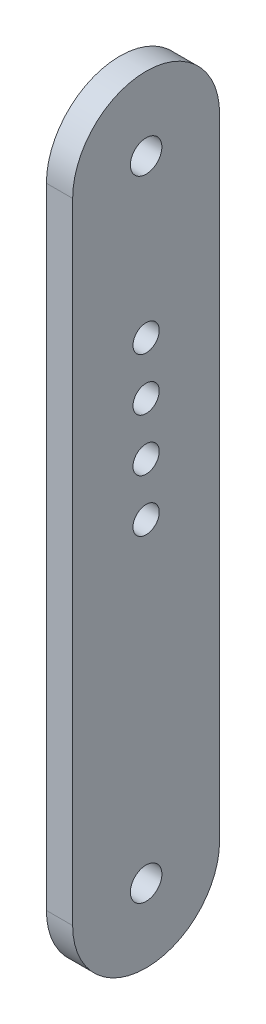
ISO-10303-21;
HEADER;
FILE_DESCRIPTION(('STEP AP214'),'2;1');
FILE_NAME('part.step','',(''),(''),'','','');
FILE_SCHEMA(('AUTOMOTIVE_DESIGN { 1 0 10303 214 1 1 1 1 }'));
ENDSEC;
DATA;
#1=APPLICATION_CONTEXT('core data for automotive mechanical design processes');
#2=APPLICATION_PROTOCOL_DEFINITION('international standard','automotive_design',2000,#1);
#3=PRODUCT_CONTEXT('',#1,'mechanical');
#4=PRODUCT('Part','Part','',(#3));
#5=PRODUCT_RELATED_PRODUCT_CATEGORY('part','',(#4));
#6=PRODUCT_DEFINITION_FORMATION('','',#4);
#7=PRODUCT_DEFINITION_CONTEXT('part definition',#1,'design');
#8=PRODUCT_DEFINITION('design','',#6,#7);
#9=PRODUCT_DEFINITION_SHAPE('','',#8);
#10=(LENGTH_UNIT() NAMED_UNIT(*) SI_UNIT(.MILLI.,.METRE.));
#11=(NAMED_UNIT(*) PLANE_ANGLE_UNIT() SI_UNIT($,.RADIAN.));
#12=(NAMED_UNIT(*) SI_UNIT($,.STERADIAN.) SOLID_ANGLE_UNIT());
#13=UNCERTAINTY_MEASURE_WITH_UNIT(LENGTH_MEASURE(1.E-05),#10,'distance_accuracy_value','');
#14=(GEOMETRIC_REPRESENTATION_CONTEXT(3) GLOBAL_UNCERTAINTY_ASSIGNED_CONTEXT((#13)) GLOBAL_UNIT_ASSIGNED_CONTEXT((#10,
#11,#12)) REPRESENTATION_CONTEXT('',''));
#15=CARTESIAN_POINT('',(0.,0.,0.));
#16=DIRECTION('',(0.,0.,1.));
#17=DIRECTION('',(1.,0.,0.));
#18=AXIS2_PLACEMENT_3D('',#15,#16,#17);
#19=CARTESIAN_POINT('',(2.5,0.,0.));
#20=DIRECTION('',(1.,0.,0.));
#21=DIRECTION('',(0.,0.,-1.));
#22=AXIS2_PLACEMENT_3D('',#19,#20,#21);
#23=PLANE('',#22);
#24=CARTESIAN_POINT('',(2.5,35.,-1.11022302462516E-13));
#25=DIRECTION('',(1.,0.,0.));
#26=DIRECTION('',(0.,0.,-1.));
#27=AXIS2_PLACEMENT_3D('',#24,#25,#26);
#28=CIRCLE('',#27,1.25);
#29=CARTESIAN_POINT('',(2.5,35.,-1.25000000000011));
#30=VERTEX_POINT('',#29);
#31=EDGE_CURVE('E161',#30,#30,#28,.T.);
#32=ORIENTED_EDGE('',*,*,#31,.F.);
#33=EDGE_LOOP('',(#32));
#34=FACE_BOUND('',#33,.T.);
#35=CARTESIAN_POINT('',(2.5,45.,0.));
#36=DIRECTION('',(1.,0.,0.));
#37=DIRECTION('',(0.,0.,-1.));
#38=AXIS2_PLACEMENT_3D('',#35,#36,#37);
#39=CIRCLE('',#38,1.25);
#40=CARTESIAN_POINT('',(2.5,45.,-1.25));
#41=VERTEX_POINT('',#40);
#42=EDGE_CURVE('E145',#41,#41,#39,.T.);
#43=ORIENTED_EDGE('',*,*,#42,.F.);
#44=EDGE_LOOP('',(#43));
#45=FACE_BOUND('',#44,.T.);
#46=CARTESIAN_POINT('',(2.5,0.,0.));
#47=DIRECTION('',(1.,0.,0.));
#48=DIRECTION('',(0.,0.,-1.));
#49=AXIS2_PLACEMENT_3D('',#46,#47,#48);
#50=CIRCLE('',#49,1.5);
#51=CARTESIAN_POINT('',(2.5,0.,-1.5));
#52=VERTEX_POINT('',#51);
#53=EDGE_CURVE('E113',#52,#52,#50,.T.);
#54=ORIENTED_EDGE('',*,*,#53,.F.);
#55=EDGE_LOOP('',(#54));
#56=FACE_BOUND('',#55,.T.);
#57=CARTESIAN_POINT('',(2.5,0.,0.));
#58=DIRECTION('',(1.,0.,0.));
#59=DIRECTION('',(0.,0.,-1.));
#60=AXIS2_PLACEMENT_3D('',#57,#58,#59);
#61=CIRCLE('',#60,7.);
#62=CARTESIAN_POINT('',(2.5,0.,7.00000000000001));
#63=VERTEX_POINT('',#62);
#64=CARTESIAN_POINT('',(2.5,0.,-7.00000000000001));
#65=VERTEX_POINT('',#64);
#66=EDGE_CURVE('E92',#63,#65,#61,.T.);
#67=ORIENTED_EDGE('',*,*,#66,.T.);
#68=DIRECTION('',(0.,1.,0.));
#69=VECTOR('',#68,1.);
#70=CARTESIAN_POINT('',(2.5,0.,-7.00000000000001));
#71=LINE('',#70,#69);
#72=CARTESIAN_POINT('',(2.5,60.,-7.00000000000001));
#73=VERTEX_POINT('',#72);
#74=EDGE_CURVE('E87',#65,#73,#71,.T.);
#75=ORIENTED_EDGE('',*,*,#74,.T.);
#76=CARTESIAN_POINT('',(2.5,60.,0.));
#77=DIRECTION('',(1.,0.,0.));
#78=DIRECTION('',(0.,0.,-1.));
#79=AXIS2_PLACEMENT_3D('',#76,#77,#78);
#80=CIRCLE('',#79,7.);
#81=CARTESIAN_POINT('',(2.5,60.,7.00000000000001));
#82=VERTEX_POINT('',#81);
#83=EDGE_CURVE('E90',#73,#82,#80,.T.);
#84=ORIENTED_EDGE('',*,*,#83,.T.);
#85=DIRECTION('',(0.,-1.,0.));
#86=VECTOR('',#85,1.);
#87=CARTESIAN_POINT('',(2.5,0.,7.00000000000001));
#88=LINE('',#87,#86);
#89=EDGE_CURVE('E57',#82,#63,#88,.T.);
#90=ORIENTED_EDGE('',*,*,#89,.T.);
#91=EDGE_LOOP('',(#67,#75,#84,#90));
#92=FACE_BOUND('',#91,.T.);
#93=CARTESIAN_POINT('',(2.5,60.,0.));
#94=DIRECTION('',(1.,0.,0.));
#95=DIRECTION('',(0.,0.,-1.));
#96=AXIS2_PLACEMENT_3D('',#93,#94,#95);
#97=CIRCLE('',#96,1.5);
#98=CARTESIAN_POINT('',(2.5,60.,-1.5));
#99=VERTEX_POINT('',#98);
#100=EDGE_CURVE('E137',#99,#99,#97,.T.);
#101=ORIENTED_EDGE('',*,*,#100,.F.);
#102=EDGE_LOOP('',(#101));
#103=FACE_BOUND('',#102,.T.);
#104=CARTESIAN_POINT('',(2.5,40.,0.));
#105=DIRECTION('',(1.,0.,0.));
#106=DIRECTION('',(0.,0.,-1.));
#107=AXIS2_PLACEMENT_3D('',#104,#105,#106);
#108=CIRCLE('',#107,1.25);
#109=CARTESIAN_POINT('',(2.5,40.,-1.25000000000006));
#110=VERTEX_POINT('',#109);
#111=EDGE_CURVE('E153',#110,#110,#108,.T.);
#112=ORIENTED_EDGE('',*,*,#111,.F.);
#113=EDGE_LOOP('',(#112));
#114=FACE_BOUND('',#113,.T.);
#115=CARTESIAN_POINT('',(2.5,30.,-1.66533453693773E-13));
#116=DIRECTION('',(1.,0.,0.));
#117=DIRECTION('',(0.,0.,-1.));
#118=AXIS2_PLACEMENT_3D('',#115,#116,#117);
#119=CIRCLE('',#118,1.25);
#120=CARTESIAN_POINT('',(2.5,30.,-1.25000000000017));
#121=VERTEX_POINT('',#120);
#122=EDGE_CURVE('E169',#121,#121,#119,.T.);
#123=ORIENTED_EDGE('',*,*,#122,.F.);
#124=EDGE_LOOP('',(#123));
#125=FACE_BOUND('',#124,.T.);
#126=ADVANCED_FACE('F39',(#34,#45,#56,#92,#103,#114,#125),#23,.T.);
#127=CARTESIAN_POINT('',(0.,0.,0.));
#128=DIRECTION('',(1.,0.,0.));
#129=DIRECTION('',(0.,0.,-1.));
#130=AXIS2_PLACEMENT_3D('',#127,#128,#129);
#131=PLANE('',#130);
#132=CARTESIAN_POINT('',(0.,0.,0.));
#133=DIRECTION('',(1.,0.,0.));
#134=DIRECTION('',(0.,0.,-1.));
#135=AXIS2_PLACEMENT_3D('',#132,#133,#134);
#136=CIRCLE('',#135,7.);
#137=CARTESIAN_POINT('',(0.,0.,7.00000000000001));
#138=VERTEX_POINT('',#137);
#139=CARTESIAN_POINT('',(0.,0.,-7.00000000000001));
#140=VERTEX_POINT('',#139);
#141=EDGE_CURVE('E109',#138,#140,#136,.T.);
#142=ORIENTED_EDGE('',*,*,#141,.F.);
#143=DIRECTION('',(0.,-1.,0.));
#144=VECTOR('',#143,1.);
#145=CARTESIAN_POINT('',(0.,0.,7.00000000000001));
#146=LINE('',#145,#144);
#147=CARTESIAN_POINT('',(0.,60.,7.00000000000001));
#148=VERTEX_POINT('',#147);
#149=EDGE_CURVE('E80',#148,#138,#146,.T.);
#150=ORIENTED_EDGE('',*,*,#149,.F.);
#151=CARTESIAN_POINT('',(0.,60.,0.));
#152=DIRECTION('',(1.,0.,0.));
#153=DIRECTION('',(0.,0.,-1.));
#154=AXIS2_PLACEMENT_3D('',#151,#152,#153);
#155=CIRCLE('',#154,7.);
#156=CARTESIAN_POINT('',(0.,60.,-7.00000000000001));
#157=VERTEX_POINT('',#156);
#158=EDGE_CURVE('E74',#157,#148,#155,.T.);
#159=ORIENTED_EDGE('',*,*,#158,.F.);
#160=DIRECTION('',(0.,1.,0.));
#161=VECTOR('',#160,1.);
#162=CARTESIAN_POINT('',(0.,0.,-7.00000000000001));
#163=LINE('',#162,#161);
#164=EDGE_CURVE('E97',#140,#157,#163,.T.);
#165=ORIENTED_EDGE('',*,*,#164,.F.);
#166=EDGE_LOOP('',(#142,#150,#159,#165));
#167=FACE_BOUND('',#166,.T.);
#168=CARTESIAN_POINT('',(0.,0.,0.));
#169=DIRECTION('',(1.,0.,0.));
#170=DIRECTION('',(0.,0.,-1.));
#171=AXIS2_PLACEMENT_3D('',#168,#169,#170);
#172=CIRCLE('',#171,1.5);
#173=CARTESIAN_POINT('',(0.,0.,-1.5));
#174=VERTEX_POINT('',#173);
#175=EDGE_CURVE('E133',#174,#174,#172,.T.);
#176=ORIENTED_EDGE('',*,*,#175,.T.);
#177=EDGE_LOOP('',(#176));
#178=FACE_BOUND('',#177,.T.);
#179=CARTESIAN_POINT('',(0.,60.,0.));
#180=DIRECTION('',(1.,0.,0.));
#181=DIRECTION('',(0.,0.,-1.));
#182=AXIS2_PLACEMENT_3D('',#179,#180,#181);
#183=CIRCLE('',#182,1.5);
#184=CARTESIAN_POINT('',(0.,60.,-1.5));
#185=VERTEX_POINT('',#184);
#186=EDGE_CURVE('E141',#185,#185,#183,.T.);
#187=ORIENTED_EDGE('',*,*,#186,.T.);
#188=EDGE_LOOP('',(#187));
#189=FACE_BOUND('',#188,.T.);
#190=CARTESIAN_POINT('',(0.,45.,0.));
#191=DIRECTION('',(1.,0.,0.));
#192=DIRECTION('',(0.,0.,-1.));
#193=AXIS2_PLACEMENT_3D('',#190,#191,#192);
#194=CIRCLE('',#193,1.25);
#195=CARTESIAN_POINT('',(0.,45.,-1.25));
#196=VERTEX_POINT('',#195);
#197=EDGE_CURVE('E149',#196,#196,#194,.T.);
#198=ORIENTED_EDGE('',*,*,#197,.T.);
#199=EDGE_LOOP('',(#198));
#200=FACE_BOUND('',#199,.T.);
#201=CARTESIAN_POINT('',(0.,40.,0.));
#202=DIRECTION('',(1.,0.,0.));
#203=DIRECTION('',(0.,0.,-1.));
#204=AXIS2_PLACEMENT_3D('',#201,#202,#203);
#205=CIRCLE('',#204,1.25);
#206=CARTESIAN_POINT('',(0.,40.,-1.25000000000006));
#207=VERTEX_POINT('',#206);
#208=EDGE_CURVE('E157',#207,#207,#205,.T.);
#209=ORIENTED_EDGE('',*,*,#208,.T.);
#210=EDGE_LOOP('',(#209));
#211=FACE_BOUND('',#210,.T.);
#212=CARTESIAN_POINT('',(0.,35.,-1.11022302462516E-13));
#213=DIRECTION('',(1.,0.,0.));
#214=DIRECTION('',(0.,0.,-1.));
#215=AXIS2_PLACEMENT_3D('',#212,#213,#214);
#216=CIRCLE('',#215,1.25);
#217=CARTESIAN_POINT('',(0.,35.,-1.25000000000011));
#218=VERTEX_POINT('',#217);
#219=EDGE_CURVE('E165',#218,#218,#216,.T.);
#220=ORIENTED_EDGE('',*,*,#219,.T.);
#221=EDGE_LOOP('',(#220));
#222=FACE_BOUND('',#221,.T.);
#223=CARTESIAN_POINT('',(0.,30.,-1.66533453693773E-13));
#224=DIRECTION('',(1.,0.,0.));
#225=DIRECTION('',(0.,0.,-1.));
#226=AXIS2_PLACEMENT_3D('',#223,#224,#225);
#227=CIRCLE('',#226,1.25);
#228=CARTESIAN_POINT('',(0.,30.,-1.25000000000017));
#229=VERTEX_POINT('',#228);
#230=EDGE_CURVE('E173',#229,#229,#227,.T.);
#231=ORIENTED_EDGE('',*,*,#230,.T.);
#232=EDGE_LOOP('',(#231));
#233=FACE_BOUND('',#232,.T.);
#234=ADVANCED_FACE('F127',(#167,#178,#189,#200,#211,#222,#233),#131,.F.);
#235=CARTESIAN_POINT('',(2.5,0.,0.));
#236=DIRECTION('',(-1.,0.,0.));
#237=DIRECTION('',(0.,0.,1.));
#238=AXIS2_PLACEMENT_3D('',#235,#236,#237);
#239=CYLINDRICAL_SURFACE('',#238,7.);
#240=ORIENTED_EDGE('',*,*,#141,.T.);
#241=DIRECTION('',(-1.,0.,0.));
#242=VECTOR('',#241,1.);
#243=CARTESIAN_POINT('',(2.5,0.,-7.00000000000001));
#244=LINE('',#243,#242);
#245=EDGE_CURVE('E11',#65,#140,#244,.T.);
#246=ORIENTED_EDGE('',*,*,#245,.F.);
#247=ORIENTED_EDGE('',*,*,#66,.F.);
#248=DIRECTION('',(-1.,0.,0.));
#249=VECTOR('',#248,1.);
#250=CARTESIAN_POINT('',(2.5,0.,7.00000000000001));
#251=LINE('',#250,#249);
#252=EDGE_CURVE('E105',#63,#138,#251,.T.);
#253=ORIENTED_EDGE('',*,*,#252,.T.);
#254=EDGE_LOOP('',(#240,#246,#247,#253));
#255=FACE_BOUND('',#254,.T.);
#256=ADVANCED_FACE('F41',(#255),#239,.T.);
#257=CARTESIAN_POINT('',(2.5,0.,-7.00000000000001));
#258=DIRECTION('',(0.,0.,1.));
#259=DIRECTION('',(1.,0.,0.));
#260=AXIS2_PLACEMENT_3D('',#257,#258,#259);
#261=PLANE('',#260);
#262=ORIENTED_EDGE('',*,*,#164,.T.);
#263=DIRECTION('',(-1.,0.,0.));
#264=VECTOR('',#263,1.);
#265=CARTESIAN_POINT('',(2.5,60.,-7.00000000000001));
#266=LINE('',#265,#264);
#267=EDGE_CURVE('E49',#73,#157,#266,.T.);
#268=ORIENTED_EDGE('',*,*,#267,.F.);
#269=ORIENTED_EDGE('',*,*,#74,.F.);
#270=ORIENTED_EDGE('',*,*,#245,.T.);
#271=EDGE_LOOP('',(#262,#268,#269,#270));
#272=FACE_BOUND('',#271,.T.);
#273=ADVANCED_FACE('F96',(#272),#261,.F.);
#274=CARTESIAN_POINT('',(2.5,60.,0.));
#275=DIRECTION('',(-1.,0.,0.));
#276=DIRECTION('',(0.,0.,1.));
#277=AXIS2_PLACEMENT_3D('',#274,#275,#276);
#278=CYLINDRICAL_SURFACE('',#277,7.);
#279=ORIENTED_EDGE('',*,*,#158,.T.);
#280=DIRECTION('',(-1.,0.,0.));
#281=VECTOR('',#280,1.);
#282=CARTESIAN_POINT('',(2.5,60.,7.00000000000001));
#283=LINE('',#282,#281);
#284=EDGE_CURVE('E99',#82,#148,#283,.T.);
#285=ORIENTED_EDGE('',*,*,#284,.F.);
#286=ORIENTED_EDGE('',*,*,#83,.F.);
#287=ORIENTED_EDGE('',*,*,#267,.T.);
#288=EDGE_LOOP('',(#279,#285,#286,#287));
#289=FACE_BOUND('',#288,.T.);
#290=ADVANCED_FACE('F100',(#289),#278,.T.);
#291=CARTESIAN_POINT('',(2.5,0.,7.00000000000001));
#292=DIRECTION('',(0.,0.,-1.));
#293=DIRECTION('',(-1.,0.,0.));
#294=AXIS2_PLACEMENT_3D('',#291,#292,#293);
#295=PLANE('',#294);
#296=ORIENTED_EDGE('',*,*,#149,.T.);
#297=ORIENTED_EDGE('',*,*,#252,.F.);
#298=ORIENTED_EDGE('',*,*,#89,.F.);
#299=ORIENTED_EDGE('',*,*,#284,.T.);
#300=EDGE_LOOP('',(#296,#297,#298,#299));
#301=FACE_BOUND('',#300,.T.);
#302=ADVANCED_FACE('F124',(#301),#295,.F.);
#303=CARTESIAN_POINT('',(2.5,0.,0.));
#304=DIRECTION('',(-1.,0.,0.));
#305=DIRECTION('',(0.,0.,1.));
#306=AXIS2_PLACEMENT_3D('',#303,#304,#305);
#307=CYLINDRICAL_SURFACE('',#306,1.5);
#308=ORIENTED_EDGE('',*,*,#53,.T.);
#309=EDGE_LOOP('',(#308));
#310=FACE_BOUND('',#309,.T.);
#311=ORIENTED_EDGE('',*,*,#175,.F.);
#312=EDGE_LOOP('',(#311));
#313=FACE_BOUND('',#312,.T.);
#314=ADVANCED_FACE('F195',(#310,#313),#307,.F.);
#315=CARTESIAN_POINT('',(2.5,60.,0.));
#316=DIRECTION('',(-1.,0.,0.));
#317=DIRECTION('',(0.,0.,1.));
#318=AXIS2_PLACEMENT_3D('',#315,#316,#317);
#319=CYLINDRICAL_SURFACE('',#318,1.5);
#320=ORIENTED_EDGE('',*,*,#100,.T.);
#321=EDGE_LOOP('',(#320));
#322=FACE_BOUND('',#321,.T.);
#323=ORIENTED_EDGE('',*,*,#186,.F.);
#324=EDGE_LOOP('',(#323));
#325=FACE_BOUND('',#324,.T.);
#326=ADVANCED_FACE('F221',(#322,#325),#319,.F.);
#327=CARTESIAN_POINT('',(2.5,45.,0.));
#328=DIRECTION('',(-1.,0.,0.));
#329=DIRECTION('',(0.,0.,1.));
#330=AXIS2_PLACEMENT_3D('',#327,#328,#329);
#331=CYLINDRICAL_SURFACE('',#330,1.25);
#332=ORIENTED_EDGE('',*,*,#42,.T.);
#333=EDGE_LOOP('',(#332));
#334=FACE_BOUND('',#333,.T.);
#335=ORIENTED_EDGE('',*,*,#197,.F.);
#336=EDGE_LOOP('',(#335));
#337=FACE_BOUND('',#336,.T.);
#338=ADVANCED_FACE('F225',(#334,#337),#331,.F.);
#339=CARTESIAN_POINT('',(2.5,40.,0.));
#340=DIRECTION('',(-1.,0.,0.));
#341=DIRECTION('',(0.,0.,1.));
#342=AXIS2_PLACEMENT_3D('',#339,#340,#341);
#343=CYLINDRICAL_SURFACE('',#342,1.25);
#344=ORIENTED_EDGE('',*,*,#111,.T.);
#345=EDGE_LOOP('',(#344));
#346=FACE_BOUND('',#345,.T.);
#347=ORIENTED_EDGE('',*,*,#208,.F.);
#348=EDGE_LOOP('',(#347));
#349=FACE_BOUND('',#348,.T.);
#350=ADVANCED_FACE('F250',(#346,#349),#343,.F.);
#351=CARTESIAN_POINT('',(2.5,35.,-1.11022302462516E-13));
#352=DIRECTION('',(-1.,0.,0.));
#353=DIRECTION('',(0.,0.,1.));
#354=AXIS2_PLACEMENT_3D('',#351,#352,#353);
#355=CYLINDRICAL_SURFACE('',#354,1.25);
#356=ORIENTED_EDGE('',*,*,#31,.T.);
#357=EDGE_LOOP('',(#356));
#358=FACE_BOUND('',#357,.T.);
#359=ORIENTED_EDGE('',*,*,#219,.F.);
#360=EDGE_LOOP('',(#359));
#361=FACE_BOUND('',#360,.T.);
#362=ADVANCED_FACE('F237',(#358,#361),#355,.F.);
#363=CARTESIAN_POINT('',(2.5,30.,-1.66533453693773E-13));
#364=DIRECTION('',(-1.,0.,0.));
#365=DIRECTION('',(0.,0.,1.));
#366=AXIS2_PLACEMENT_3D('',#363,#364,#365);
#367=CYLINDRICAL_SURFACE('',#366,1.25);
#368=ORIENTED_EDGE('',*,*,#122,.T.);
#369=EDGE_LOOP('',(#368));
#370=FACE_BOUND('',#369,.T.);
#371=ORIENTED_EDGE('',*,*,#230,.F.);
#372=EDGE_LOOP('',(#371));
#373=FACE_BOUND('',#372,.T.);
#374=ADVANCED_FACE('F182',(#370,#373),#367,.F.);
#375=CLOSED_SHELL('',(#126,#234,#256,#273,#290,#302,#314,#326,#338,#350,#362,#374));
#376=MANIFOLD_SOLID_BREP('B2',#375);
#377=ADVANCED_BREP_SHAPE_REPRESENTATION('',(#18,#376),#14);
#378=SHAPE_DEFINITION_REPRESENTATION(#9,#377);
ENDSEC;
END-ISO-10303-21;
